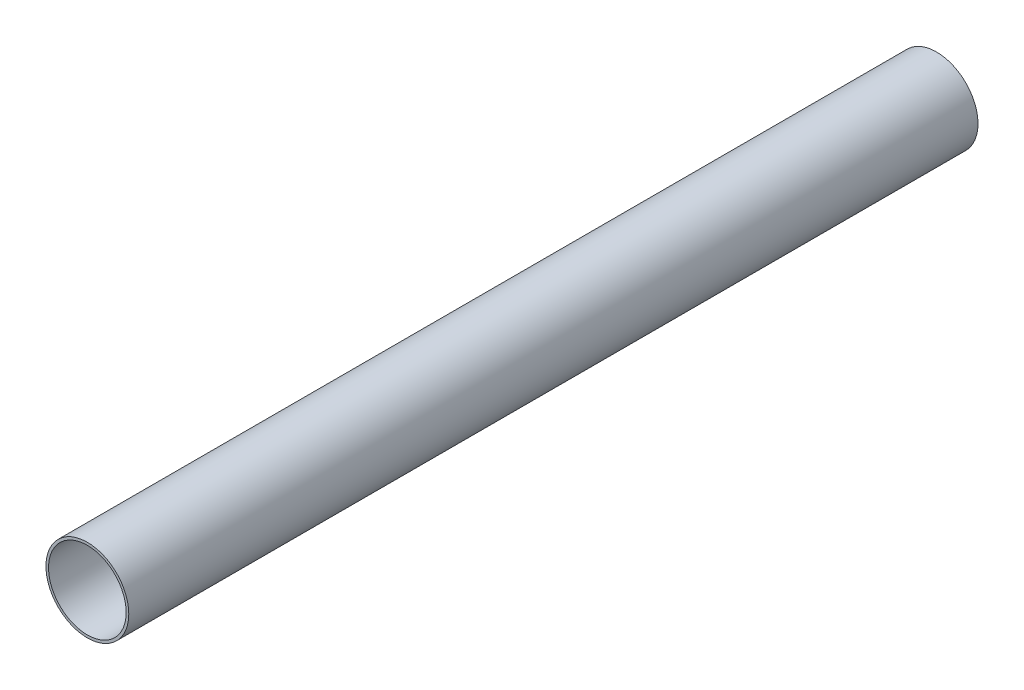
ISO-10303-21;
HEADER;
FILE_DESCRIPTION(('STEP AP214'),'2;1');
FILE_NAME('part.step','',(''),(''),'','','');
FILE_SCHEMA(('AUTOMOTIVE_DESIGN { 1 0 10303 214 1 1 1 1 }'));
ENDSEC;
DATA;
#1=APPLICATION_CONTEXT('core data for automotive mechanical design processes');
#2=APPLICATION_PROTOCOL_DEFINITION('international standard','automotive_design',2000,#1);
#3=PRODUCT_CONTEXT('',#1,'mechanical');
#4=PRODUCT('Part','Part','',(#3));
#5=PRODUCT_RELATED_PRODUCT_CATEGORY('part','',(#4));
#6=PRODUCT_DEFINITION_FORMATION('','',#4);
#7=PRODUCT_DEFINITION_CONTEXT('part definition',#1,'design');
#8=PRODUCT_DEFINITION('design','',#6,#7);
#9=PRODUCT_DEFINITION_SHAPE('','',#8);
#10=(LENGTH_UNIT() NAMED_UNIT(*) SI_UNIT(.MILLI.,.METRE.));
#11=(NAMED_UNIT(*) PLANE_ANGLE_UNIT() SI_UNIT($,.RADIAN.));
#12=(NAMED_UNIT(*) SI_UNIT($,.STERADIAN.) SOLID_ANGLE_UNIT());
#13=UNCERTAINTY_MEASURE_WITH_UNIT(LENGTH_MEASURE(1.E-05),#10,'distance_accuracy_value','');
#14=(GEOMETRIC_REPRESENTATION_CONTEXT(3) GLOBAL_UNCERTAINTY_ASSIGNED_CONTEXT((#13)) GLOBAL_UNIT_ASSIGNED_CONTEXT((#10,
#11,#12)) REPRESENTATION_CONTEXT('',''));
#15=CARTESIAN_POINT('',(0.,0.,0.));
#16=DIRECTION('',(0.,0.,1.));
#17=DIRECTION('',(1.,0.,0.));
#18=AXIS2_PLACEMENT_3D('',#15,#16,#17);
#19=CARTESIAN_POINT('',(0.,0.,1041.4));
#20=DIRECTION('',(0.,0.,1.));
#21=DIRECTION('',(1.,0.,0.));
#22=AXIS2_PLACEMENT_3D('',#19,#20,#21);
#23=PLANE('',#22);
#24=CARTESIAN_POINT('',(0.,0.,1041.4));
#25=DIRECTION('',(0.,0.,1.));
#26=DIRECTION('',(1.,0.,0.));
#27=AXIS2_PLACEMENT_3D('',#24,#25,#26);
#28=CIRCLE('',#27,50.8);
#29=CARTESIAN_POINT('',(50.8,0.,1041.4));
#30=VERTEX_POINT('',#29);
#31=EDGE_CURVE('E10',#30,#30,#28,.T.);
#32=ORIENTED_EDGE('',*,*,#31,.T.);
#33=EDGE_LOOP('',(#32));
#34=FACE_BOUND('',#33,.T.);
#35=CARTESIAN_POINT('',(0.,0.,1041.4));
#36=DIRECTION('',(0.,0.,1.));
#37=DIRECTION('',(1.,0.,0.));
#38=AXIS2_PLACEMENT_3D('',#35,#36,#37);
#39=CIRCLE('',#38,47.625);
#40=CARTESIAN_POINT('',(47.625,0.,1041.4));
#41=VERTEX_POINT('',#40);
#42=EDGE_CURVE('E42',#41,#41,#39,.T.);
#43=ORIENTED_EDGE('',*,*,#42,.F.);
#44=EDGE_LOOP('',(#43));
#45=FACE_BOUND('',#44,.T.);
#46=ADVANCED_FACE('F31',(#34,#45),#23,.T.);
#47=CARTESIAN_POINT('',(0.,0.,0.));
#48=DIRECTION('',(0.,0.,1.));
#49=DIRECTION('',(1.,0.,0.));
#50=AXIS2_PLACEMENT_3D('',#47,#48,#49);
#51=PLANE('',#50);
#52=CARTESIAN_POINT('',(0.,0.,0.));
#53=DIRECTION('',(0.,0.,1.));
#54=DIRECTION('',(1.,0.,0.));
#55=AXIS2_PLACEMENT_3D('',#52,#53,#54);
#56=CIRCLE('',#55,50.8);
#57=CARTESIAN_POINT('',(50.8,0.,0.));
#58=VERTEX_POINT('',#57);
#59=EDGE_CURVE('E35',#58,#58,#56,.T.);
#60=ORIENTED_EDGE('',*,*,#59,.F.);
#61=EDGE_LOOP('',(#60));
#62=FACE_BOUND('',#61,.T.);
#63=CARTESIAN_POINT('',(0.,0.,0.));
#64=DIRECTION('',(0.,0.,1.));
#65=DIRECTION('',(1.,0.,0.));
#66=AXIS2_PLACEMENT_3D('',#63,#64,#65);
#67=CIRCLE('',#66,47.625);
#68=CARTESIAN_POINT('',(47.625,0.,0.));
#69=VERTEX_POINT('',#68);
#70=EDGE_CURVE('E44',#69,#69,#67,.T.);
#71=ORIENTED_EDGE('',*,*,#70,.T.);
#72=EDGE_LOOP('',(#71));
#73=FACE_BOUND('',#72,.T.);
#74=ADVANCED_FACE('F54',(#62,#73),#51,.F.);
#75=CARTESIAN_POINT('',(0.,0.,1041.4));
#76=DIRECTION('',(0.,0.,-1.));
#77=DIRECTION('',(-1.,0.,0.));
#78=AXIS2_PLACEMENT_3D('',#75,#76,#77);
#79=CYLINDRICAL_SURFACE('',#78,50.8);
#80=ORIENTED_EDGE('',*,*,#31,.F.);
#81=EDGE_LOOP('',(#80));
#82=FACE_BOUND('',#81,.T.);
#83=ORIENTED_EDGE('',*,*,#59,.T.);
#84=EDGE_LOOP('',(#83));
#85=FACE_BOUND('',#84,.T.);
#86=ADVANCED_FACE('F33',(#82,#85),#79,.T.);
#87=CARTESIAN_POINT('',(0.,0.,1041.4));
#88=DIRECTION('',(0.,0.,-1.));
#89=DIRECTION('',(-1.,0.,0.));
#90=AXIS2_PLACEMENT_3D('',#87,#88,#89);
#91=CYLINDRICAL_SURFACE('',#90,47.625);
#92=ORIENTED_EDGE('',*,*,#42,.T.);
#93=EDGE_LOOP('',(#92));
#94=FACE_BOUND('',#93,.T.);
#95=ORIENTED_EDGE('',*,*,#70,.F.);
#96=EDGE_LOOP('',(#95));
#97=FACE_BOUND('',#96,.T.);
#98=ADVANCED_FACE('F50',(#94,#97),#91,.F.);
#99=CLOSED_SHELL('',(#46,#74,#86,#98));
#100=MANIFOLD_SOLID_BREP('B2',#99);
#101=ADVANCED_BREP_SHAPE_REPRESENTATION('',(#18,#100),#14);
#102=SHAPE_DEFINITION_REPRESENTATION(#9,#101);
ENDSEC;
END-ISO-10303-21;
